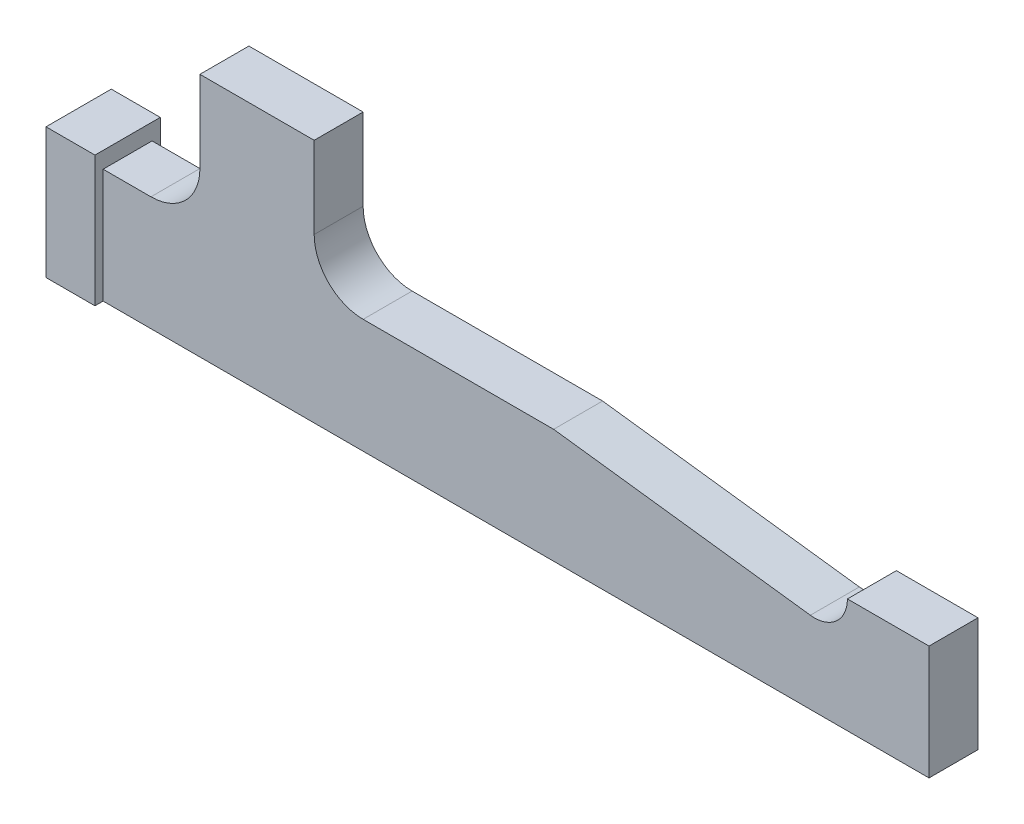
ISO-10303-21;
HEADER;
FILE_DESCRIPTION(('STEP AP214'),'2;1');
FILE_NAME('part.step','',(''),(''),'','','');
FILE_SCHEMA(('AUTOMOTIVE_DESIGN { 1 0 10303 214 1 1 1 1 }'));
ENDSEC;
DATA;
#1=APPLICATION_CONTEXT('core data for automotive mechanical design processes');
#2=APPLICATION_PROTOCOL_DEFINITION('international standard','automotive_design',2000,#1);
#3=PRODUCT_CONTEXT('',#1,'mechanical');
#4=PRODUCT('Part','Part','',(#3));
#5=PRODUCT_RELATED_PRODUCT_CATEGORY('part','',(#4));
#6=PRODUCT_DEFINITION_FORMATION('','',#4);
#7=PRODUCT_DEFINITION_CONTEXT('part definition',#1,'design');
#8=PRODUCT_DEFINITION('design','',#6,#7);
#9=PRODUCT_DEFINITION_SHAPE('','',#8);
#10=(LENGTH_UNIT() NAMED_UNIT(*) SI_UNIT(.MILLI.,.METRE.));
#11=(NAMED_UNIT(*) PLANE_ANGLE_UNIT() SI_UNIT($,.RADIAN.));
#12=(NAMED_UNIT(*) SI_UNIT($,.STERADIAN.) SOLID_ANGLE_UNIT());
#13=UNCERTAINTY_MEASURE_WITH_UNIT(LENGTH_MEASURE(1.E-05),#10,'distance_accuracy_value','');
#14=(GEOMETRIC_REPRESENTATION_CONTEXT(3) GLOBAL_UNCERTAINTY_ASSIGNED_CONTEXT((#13)) GLOBAL_UNIT_ASSIGNED_CONTEXT((#10,
#11,#12)) REPRESENTATION_CONTEXT('',''));
#15=CARTESIAN_POINT('',(0.,0.,0.));
#16=DIRECTION('',(0.,0.,1.));
#17=DIRECTION('',(1.,0.,0.));
#18=AXIS2_PLACEMENT_3D('',#15,#16,#17);
#19=CARTESIAN_POINT('',(0.,7.,1.5));
#20=DIRECTION('',(0.,-1.,0.));
#21=DIRECTION('',(1.,0.,0.));
#22=AXIS2_PLACEMENT_3D('',#19,#20,#21);
#23=PLANE('',#22);
#24=DIRECTION('',(-1.,0.,0.));
#25=VECTOR('',#24,1.);
#26=CARTESIAN_POINT('',(0.,7.,-1.5));
#27=LINE('',#26,#25);
#28=CARTESIAN_POINT('',(0.,7.,-1.5));
#29=VERTEX_POINT('',#28);
#30=CARTESIAN_POINT('',(-5.,7.,-1.5));
#31=VERTEX_POINT('',#30);
#32=EDGE_CURVE('E162',#29,#31,#27,.T.);
#33=ORIENTED_EDGE('',*,*,#32,.T.);
#34=DIRECTION('',(0.,0.,-1.));
#35=VECTOR('',#34,1.);
#36=CARTESIAN_POINT('',(-5.,7.,1.5));
#37=LINE('',#36,#35);
#38=CARTESIAN_POINT('',(-5.,7.,1.5));
#39=VERTEX_POINT('',#38);
#40=EDGE_CURVE('E11',#39,#31,#37,.T.);
#41=ORIENTED_EDGE('',*,*,#40,.F.);
#42=DIRECTION('',(-1.,0.,0.));
#43=VECTOR('',#42,1.);
#44=CARTESIAN_POINT('',(0.,7.,1.5));
#45=LINE('',#44,#43);
#46=CARTESIAN_POINT('',(0.,7.,1.5));
#47=VERTEX_POINT('',#46);
#48=EDGE_CURVE('E169',#47,#39,#45,.T.);
#49=ORIENTED_EDGE('',*,*,#48,.F.);
#50=DIRECTION('',(0.,0.,-1.));
#51=VECTOR('',#50,1.);
#52=CARTESIAN_POINT('',(0.,7.,1.5));
#53=LINE('',#52,#51);
#54=EDGE_CURVE('E194',#47,#29,#53,.T.);
#55=ORIENTED_EDGE('',*,*,#54,.T.);
#56=EDGE_LOOP('',(#33,#41,#49,#55));
#57=FACE_BOUND('',#56,.T.);
#58=ADVANCED_FACE('F35',(#57),#23,.F.);
#59=CARTESIAN_POINT('',(-7.01610200176435,7.,1.5));
#60=DIRECTION('',(0.,0.,-1.));
#61=DIRECTION('',(-1.,0.,0.));
#62=AXIS2_PLACEMENT_3D('',#59,#60,#61);
#63=CYLINDRICAL_SURFACE('',#62,2.01610200176435);
#64=CARTESIAN_POINT('',(-7.01610200176435,7.,-1.5));
#65=DIRECTION('',(0.,0.,1.));
#66=DIRECTION('',(1.,0.,0.));
#67=AXIS2_PLACEMENT_3D('',#64,#65,#66);
#68=CIRCLE('',#67,2.01610200176435);
#69=CARTESIAN_POINT('',(-7.27039962565853,5.,-1.5));
#70=VERTEX_POINT('',#69);
#71=EDGE_CURVE('E197',#31,#70,#68,.F.);
#72=ORIENTED_EDGE('',*,*,#71,.T.);
#73=DIRECTION('',(0.,0.,-1.));
#74=VECTOR('',#73,1.);
#75=CARTESIAN_POINT('',(-7.27039962565853,5.,1.5));
#76=LINE('',#75,#74);
#77=CARTESIAN_POINT('',(-7.27039962565853,5.,1.5));
#78=VERTEX_POINT('',#77);
#79=EDGE_CURVE('E43',#78,#70,#76,.T.);
#80=ORIENTED_EDGE('',*,*,#79,.F.);
#81=CARTESIAN_POINT('',(-7.01610200176435,7.,1.5));
#82=DIRECTION('',(0.,0.,1.));
#83=DIRECTION('',(1.,0.,0.));
#84=AXIS2_PLACEMENT_3D('',#81,#82,#83);
#85=CIRCLE('',#84,2.01610200176435);
#86=EDGE_CURVE('E103',#39,#78,#85,.F.);
#87=ORIENTED_EDGE('',*,*,#86,.F.);
#88=ORIENTED_EDGE('',*,*,#40,.T.);
#89=EDGE_LOOP('',(#72,#80,#87,#88));
#90=FACE_BOUND('',#89,.T.);
#91=ADVANCED_FACE('F251',(#90),#63,.F.);
#92=CARTESIAN_POINT('',(0.509960377082842,4.01073646913078,1.5));
#93=DIRECTION('',(0.126133312536585,0.992013300046198,0.));
#94=DIRECTION('',(-0.992013300046198,0.126133312536585,0.));
#95=AXIS2_PLACEMENT_3D('',#92,#93,#94);
#96=PLANE('',#95);
#97=DIRECTION('',(0.992013300046198,-0.126133312536585,0.));
#98=VECTOR('',#97,1.);
#99=CARTESIAN_POINT('',(0.509960377082842,4.01073646913078,-1.5));
#100=LINE('',#99,#98);
#101=CARTESIAN_POINT('',(-23.,7.,-1.5));
#102=VERTEX_POINT('',#101);
#103=EDGE_CURVE('E200',#102,#70,#100,.T.);
#104=ORIENTED_EDGE('',*,*,#103,.F.);
#105=DIRECTION('',(0.,0.,-1.));
#106=VECTOR('',#105,1.);
#107=CARTESIAN_POINT('',(-23.,7.,1.5));
#108=LINE('',#107,#106);
#109=CARTESIAN_POINT('',(-23.,7.,1.5));
#110=VERTEX_POINT('',#109);
#111=EDGE_CURVE('E246',#110,#102,#108,.T.);
#112=ORIENTED_EDGE('',*,*,#111,.F.);
#113=DIRECTION('',(0.992013300046198,-0.126133312536585,0.));
#114=VECTOR('',#113,1.);
#115=CARTESIAN_POINT('',(0.509960377082842,4.01073646913078,1.5));
#116=LINE('',#115,#114);
#117=EDGE_CURVE('E172',#110,#78,#116,.T.);
#118=ORIENTED_EDGE('',*,*,#117,.T.);
#119=ORIENTED_EDGE('',*,*,#79,.T.);
#120=EDGE_LOOP('',(#104,#112,#118,#119));
#121=FACE_BOUND('',#120,.T.);
#122=ADVANCED_FACE('F249',(#121),#96,.T.);
#123=CARTESIAN_POINT('',(0.,7.00000000000002,1.5));
#124=DIRECTION('',(0.,1.,0.));
#125=DIRECTION('',(-1.,0.,0.));
#126=AXIS2_PLACEMENT_3D('',#123,#124,#125);
#127=PLANE('',#126);
#128=DIRECTION('',(1.,0.,0.));
#129=VECTOR('',#128,1.);
#130=CARTESIAN_POINT('',(0.,7.00000000000002,-1.5));
#131=LINE('',#130,#129);
#132=CARTESIAN_POINT('',(-34.67,6.99999999999999,-1.5));
#133=VERTEX_POINT('',#132);
#134=EDGE_CURVE('E203',#133,#102,#131,.T.);
#135=ORIENTED_EDGE('',*,*,#134,.F.);
#136=DIRECTION('',(0.,0.,-1.));
#137=VECTOR('',#136,1.);
#138=CARTESIAN_POINT('',(-34.67,6.99999999999999,1.5));
#139=LINE('',#138,#137);
#140=CARTESIAN_POINT('',(-34.67,6.99999999999999,1.5));
#141=VERTEX_POINT('',#140);
#142=EDGE_CURVE('E244',#141,#133,#139,.T.);
#143=ORIENTED_EDGE('',*,*,#142,.F.);
#144=DIRECTION('',(1.,0.,0.));
#145=VECTOR('',#144,1.);
#146=CARTESIAN_POINT('',(0.,7.00000000000002,1.5));
#147=LINE('',#146,#145);
#148=EDGE_CURVE('E175',#141,#110,#147,.T.);
#149=ORIENTED_EDGE('',*,*,#148,.T.);
#150=ORIENTED_EDGE('',*,*,#111,.T.);
#151=EDGE_LOOP('',(#135,#143,#149,#150));
#152=FACE_BOUND('',#151,.T.);
#153=ADVANCED_FACE('F259',(#152),#127,.T.);
#154=CARTESIAN_POINT('',(-34.67,9.99999999999999,1.5));
#155=DIRECTION('',(0.,0.,-1.));
#156=DIRECTION('',(-1.,0.,0.));
#157=AXIS2_PLACEMENT_3D('',#154,#155,#156);
#158=CYLINDRICAL_SURFACE('',#157,3.);
#159=CARTESIAN_POINT('',(-34.67,9.99999999999999,-1.5));
#160=DIRECTION('',(0.,0.,1.));
#161=DIRECTION('',(1.,0.,0.));
#162=AXIS2_PLACEMENT_3D('',#159,#160,#161);
#163=CIRCLE('',#162,3.);
#164=CARTESIAN_POINT('',(-37.67,9.99999999999999,-1.5));
#165=VERTEX_POINT('',#164);
#166=EDGE_CURVE('E206',#165,#133,#163,.T.);
#167=ORIENTED_EDGE('',*,*,#166,.F.);
#168=DIRECTION('',(0.,0.,-1.));
#169=VECTOR('',#168,1.);
#170=CARTESIAN_POINT('',(-37.67,9.99999999999999,1.5));
#171=LINE('',#170,#169);
#172=CARTESIAN_POINT('',(-37.67,9.99999999999999,1.5));
#173=VERTEX_POINT('',#172);
#174=EDGE_CURVE('E242',#173,#165,#171,.T.);
#175=ORIENTED_EDGE('',*,*,#174,.F.);
#176=CARTESIAN_POINT('',(-34.67,9.99999999999999,1.5));
#177=DIRECTION('',(0.,0.,1.));
#178=DIRECTION('',(1.,0.,0.));
#179=AXIS2_PLACEMENT_3D('',#176,#177,#178);
#180=CIRCLE('',#179,3.);
#181=EDGE_CURVE('E178',#173,#141,#180,.T.);
#182=ORIENTED_EDGE('',*,*,#181,.T.);
#183=ORIENTED_EDGE('',*,*,#142,.T.);
#184=EDGE_LOOP('',(#167,#175,#182,#183));
#185=FACE_BOUND('',#184,.T.);
#186=ADVANCED_FACE('F320',(#185),#158,.F.);
#187=CARTESIAN_POINT('',(-37.67,0.,1.5));
#188=DIRECTION('',(1.,0.,0.));
#189=DIRECTION('',(0.,0.,-1.));
#190=AXIS2_PLACEMENT_3D('',#187,#188,#189);
#191=PLANE('',#190);
#192=DIRECTION('',(0.,-1.,0.));
#193=VECTOR('',#192,1.);
#194=CARTESIAN_POINT('',(-37.67,0.,-1.5));
#195=LINE('',#194,#193);
#196=CARTESIAN_POINT('',(-37.67,15.,-1.5));
#197=VERTEX_POINT('',#196);
#198=EDGE_CURVE('E209',#197,#165,#195,.T.);
#199=ORIENTED_EDGE('',*,*,#198,.F.);
#200=DIRECTION('',(0.,0.,-1.));
#201=VECTOR('',#200,1.);
#202=CARTESIAN_POINT('',(-37.67,15.,1.5));
#203=LINE('',#202,#201);
#204=CARTESIAN_POINT('',(-37.67,15.,1.5));
#205=VERTEX_POINT('',#204);
#206=EDGE_CURVE('E240',#205,#197,#203,.T.);
#207=ORIENTED_EDGE('',*,*,#206,.F.);
#208=DIRECTION('',(0.,-1.,0.));
#209=VECTOR('',#208,1.);
#210=CARTESIAN_POINT('',(-37.67,0.,1.5));
#211=LINE('',#210,#209);
#212=EDGE_CURVE('E181',#205,#173,#211,.T.);
#213=ORIENTED_EDGE('',*,*,#212,.T.);
#214=ORIENTED_EDGE('',*,*,#174,.T.);
#215=EDGE_LOOP('',(#199,#207,#213,#214));
#216=FACE_BOUND('',#215,.T.);
#217=ADVANCED_FACE('F317',(#216),#191,.T.);
#218=CARTESIAN_POINT('',(0.,15.,1.5));
#219=DIRECTION('',(0.,1.,0.));
#220=DIRECTION('',(-1.,0.,0.));
#221=AXIS2_PLACEMENT_3D('',#218,#219,#220);
#222=PLANE('',#221);
#223=DIRECTION('',(1.,0.,0.));
#224=VECTOR('',#223,1.);
#225=CARTESIAN_POINT('',(0.,15.,-1.5));
#226=LINE('',#225,#224);
#227=CARTESIAN_POINT('',(-44.67,15.,-1.5));
#228=VERTEX_POINT('',#227);
#229=EDGE_CURVE('E212',#228,#197,#226,.T.);
#230=ORIENTED_EDGE('',*,*,#229,.F.);
#231=DIRECTION('',(0.,0.,-1.));
#232=VECTOR('',#231,1.);
#233=CARTESIAN_POINT('',(-44.67,15.,1.5));
#234=LINE('',#233,#232);
#235=CARTESIAN_POINT('',(-44.67,15.,1.5));
#236=VERTEX_POINT('',#235);
#237=EDGE_CURVE('E238',#236,#228,#234,.T.);
#238=ORIENTED_EDGE('',*,*,#237,.F.);
#239=DIRECTION('',(1.,0.,0.));
#240=VECTOR('',#239,1.);
#241=CARTESIAN_POINT('',(0.,15.,1.5));
#242=LINE('',#241,#240);
#243=EDGE_CURVE('E184',#236,#205,#242,.T.);
#244=ORIENTED_EDGE('',*,*,#243,.T.);
#245=ORIENTED_EDGE('',*,*,#206,.T.);
#246=EDGE_LOOP('',(#230,#238,#244,#245));
#247=FACE_BOUND('',#246,.T.);
#248=ADVANCED_FACE('F314',(#247),#222,.T.);
#249=CARTESIAN_POINT('',(-44.67,0.,1.5));
#250=DIRECTION('',(-1.,0.,0.));
#251=DIRECTION('',(0.,-1.,0.));
#252=AXIS2_PLACEMENT_3D('',#249,#250,#251);
#253=PLANE('',#252);
#254=DIRECTION('',(0.,1.,0.));
#255=VECTOR('',#254,1.);
#256=CARTESIAN_POINT('',(-44.67,0.,-1.5));
#257=LINE('',#256,#255);
#258=CARTESIAN_POINT('',(-44.67,9.99999999999999,-1.5));
#259=VERTEX_POINT('',#258);
#260=EDGE_CURVE('E215',#259,#228,#257,.T.);
#261=ORIENTED_EDGE('',*,*,#260,.F.);
#262=DIRECTION('',(0.,0.,-1.));
#263=VECTOR('',#262,1.);
#264=CARTESIAN_POINT('',(-44.67,9.99999999999999,1.5));
#265=LINE('',#264,#263);
#266=CARTESIAN_POINT('',(-44.67,9.99999999999999,1.5));
#267=VERTEX_POINT('',#266);
#268=EDGE_CURVE('E236',#267,#259,#265,.T.);
#269=ORIENTED_EDGE('',*,*,#268,.F.);
#270=DIRECTION('',(0.,1.,0.));
#271=VECTOR('',#270,1.);
#272=CARTESIAN_POINT('',(-44.67,0.,1.5));
#273=LINE('',#272,#271);
#274=EDGE_CURVE('E187',#267,#236,#273,.T.);
#275=ORIENTED_EDGE('',*,*,#274,.T.);
#276=ORIENTED_EDGE('',*,*,#237,.T.);
#277=EDGE_LOOP('',(#261,#269,#275,#276));
#278=FACE_BOUND('',#277,.T.);
#279=ADVANCED_FACE('F308',(#278),#253,.T.);
#280=CARTESIAN_POINT('',(-47.67,9.99999999999999,1.5));
#281=DIRECTION('',(0.,0.,-1.));
#282=DIRECTION('',(-1.,0.,0.));
#283=AXIS2_PLACEMENT_3D('',#280,#281,#282);
#284=CYLINDRICAL_SURFACE('',#283,3.);
#285=CARTESIAN_POINT('',(-47.67,9.99999999999999,-1.5));
#286=DIRECTION('',(0.,0.,1.));
#287=DIRECTION('',(1.,0.,0.));
#288=AXIS2_PLACEMENT_3D('',#285,#286,#287);
#289=CIRCLE('',#288,3.);
#290=CARTESIAN_POINT('',(-47.67,6.99999999999999,-1.5));
#291=VERTEX_POINT('',#290);
#292=EDGE_CURVE('E218',#259,#291,#289,.F.);
#293=ORIENTED_EDGE('',*,*,#292,.T.);
#294=DIRECTION('',(0.,0.,-1.));
#295=VECTOR('',#294,1.);
#296=CARTESIAN_POINT('',(-47.67,6.99999999999999,1.5));
#297=LINE('',#296,#295);
#298=CARTESIAN_POINT('',(-47.67,6.99999999999999,1.5));
#299=VERTEX_POINT('',#298);
#300=EDGE_CURVE('E234',#299,#291,#297,.T.);
#301=ORIENTED_EDGE('',*,*,#300,.F.);
#302=CARTESIAN_POINT('',(-47.67,9.99999999999999,1.5));
#303=DIRECTION('',(0.,0.,1.));
#304=DIRECTION('',(1.,0.,0.));
#305=AXIS2_PLACEMENT_3D('',#302,#303,#304);
#306=CIRCLE('',#305,3.);
#307=EDGE_CURVE('E190',#267,#299,#306,.F.);
#308=ORIENTED_EDGE('',*,*,#307,.F.);
#309=ORIENTED_EDGE('',*,*,#268,.T.);
#310=EDGE_LOOP('',(#293,#301,#308,#309));
#311=FACE_BOUND('',#310,.T.);
#312=ADVANCED_FACE('F321',(#311),#284,.F.);
#313=CARTESIAN_POINT('',(0.,6.99999999999999,1.5));
#314=DIRECTION('',(0.,1.,0.));
#315=DIRECTION('',(0.,0.,1.));
#316=AXIS2_PLACEMENT_3D('',#313,#314,#315);
#317=PLANE('',#316);
#318=DIRECTION('',(1.,0.,0.));
#319=VECTOR('',#318,1.);
#320=CARTESIAN_POINT('',(0.,6.99999999999999,-1.5));
#321=LINE('',#320,#319);
#322=CARTESIAN_POINT('',(-50.6,6.99999999999999,-1.5));
#323=VERTEX_POINT('',#322);
#324=EDGE_CURVE('E221',#323,#291,#321,.T.);
#325=ORIENTED_EDGE('',*,*,#324,.F.);
#326=DIRECTION('',(0.,0.,-1.));
#327=VECTOR('',#326,1.);
#328=CARTESIAN_POINT('',(-50.6,6.99999999999999,1.5));
#329=LINE('',#328,#327);
#330=CARTESIAN_POINT('',(-50.6,6.99999999999999,1.5));
#331=VERTEX_POINT('',#330);
#332=EDGE_CURVE('E232',#331,#323,#329,.T.);
#333=ORIENTED_EDGE('',*,*,#332,.F.);
#334=DIRECTION('',(1.,0.,0.));
#335=VECTOR('',#334,1.);
#336=CARTESIAN_POINT('',(0.,6.99999999999999,1.5));
#337=LINE('',#336,#335);
#338=EDGE_CURVE('E139',#331,#299,#337,.T.);
#339=ORIENTED_EDGE('',*,*,#338,.T.);
#340=ORIENTED_EDGE('',*,*,#300,.T.);
#341=EDGE_LOOP('',(#325,#333,#339,#340));
#342=FACE_BOUND('',#341,.T.);
#343=ADVANCED_FACE('F302',(#342),#317,.T.);
#344=CARTESIAN_POINT('',(0.,0.,1.5));
#345=DIRECTION('',(0.,-1.,0.));
#346=DIRECTION('',(1.,0.,0.));
#347=AXIS2_PLACEMENT_3D('',#344,#345,#346);
#348=PLANE('',#347);
#349=DIRECTION('',(-1.,0.,0.));
#350=VECTOR('',#349,1.);
#351=CARTESIAN_POINT('',(0.,0.,-1.5));
#352=LINE('',#351,#350);
#353=CARTESIAN_POINT('',(0.,0.,-1.5));
#354=VERTEX_POINT('',#353);
#355=CARTESIAN_POINT('',(-50.6,0.,-1.5));
#356=VERTEX_POINT('',#355);
#357=EDGE_CURVE('E227',#354,#356,#352,.T.);
#358=ORIENTED_EDGE('',*,*,#357,.F.);
#359=DIRECTION('',(0.,0.,-1.));
#360=VECTOR('',#359,1.);
#361=CARTESIAN_POINT('',(0.,0.,1.5));
#362=LINE('',#361,#360);
#363=CARTESIAN_POINT('',(0.,0.,1.5));
#364=VERTEX_POINT('',#363);
#365=EDGE_CURVE('E92',#364,#354,#362,.T.);
#366=ORIENTED_EDGE('',*,*,#365,.F.);
#367=DIRECTION('',(-1.,0.,0.));
#368=VECTOR('',#367,1.);
#369=CARTESIAN_POINT('',(0.,0.,1.5));
#370=LINE('',#369,#368);
#371=CARTESIAN_POINT('',(-50.6,0.,1.5));
#372=VERTEX_POINT('',#371);
#373=EDGE_CURVE('E137',#364,#372,#370,.T.);
#374=ORIENTED_EDGE('',*,*,#373,.T.);
#375=DIRECTION('',(0.,0.,-1.));
#376=VECTOR('',#375,1.);
#377=CARTESIAN_POINT('',(-50.6,0.,2.));
#378=LINE('',#377,#376);
#379=CARTESIAN_POINT('',(-50.6,0.,2.));
#380=VERTEX_POINT('',#379);
#381=EDGE_CURVE('E150',#380,#372,#378,.T.);
#382=ORIENTED_EDGE('',*,*,#381,.F.);
#383=DIRECTION('',(-1.,0.,0.));
#384=VECTOR('',#383,1.);
#385=CARTESIAN_POINT('',(0.,0.,2.));
#386=LINE('',#385,#384);
#387=CARTESIAN_POINT('',(-53.6,0.,2.));
#388=VERTEX_POINT('',#387);
#389=EDGE_CURVE('E462',#380,#388,#386,.T.);
#390=ORIENTED_EDGE('',*,*,#389,.T.);
#391=DIRECTION('',(0.,0.,-1.));
#392=VECTOR('',#391,1.);
#393=CARTESIAN_POINT('',(-53.6,0.,2.));
#394=LINE('',#393,#392);
#395=CARTESIAN_POINT('',(-53.6,0.,-2.));
#396=VERTEX_POINT('',#395);
#397=EDGE_CURVE('E158',#388,#396,#394,.T.);
#398=ORIENTED_EDGE('',*,*,#397,.T.);
#399=DIRECTION('',(-1.,0.,0.));
#400=VECTOR('',#399,1.);
#401=CARTESIAN_POINT('',(0.,0.,-2.));
#402=LINE('',#401,#400);
#403=CARTESIAN_POINT('',(-50.6,0.,-2.));
#404=VERTEX_POINT('',#403);
#405=EDGE_CURVE('E269',#404,#396,#402,.T.);
#406=ORIENTED_EDGE('',*,*,#405,.F.);
#407=EDGE_CURVE('E159',#356,#404,#378,.T.);
#408=ORIENTED_EDGE('',*,*,#407,.F.);
#409=EDGE_LOOP('',(#358,#366,#374,#382,#390,#398,#406,#408));
#410=FACE_BOUND('',#409,.T.);
#411=ADVANCED_FACE('F147',(#410),#348,.T.);
#412=CARTESIAN_POINT('',(0.,0.,1.5));
#413=DIRECTION('',(-1.,0.,0.));
#414=DIRECTION('',(0.,0.,1.));
#415=AXIS2_PLACEMENT_3D('',#412,#413,#414);
#416=PLANE('',#415);
#417=DIRECTION('',(0.,1.,0.));
#418=VECTOR('',#417,1.);
#419=CARTESIAN_POINT('',(0.,0.,-1.5));
#420=LINE('',#419,#418);
#421=EDGE_CURVE('E95',#354,#29,#420,.T.);
#422=ORIENTED_EDGE('',*,*,#421,.T.);
#423=ORIENTED_EDGE('',*,*,#54,.F.);
#424=DIRECTION('',(0.,1.,0.));
#425=VECTOR('',#424,1.);
#426=CARTESIAN_POINT('',(0.,0.,1.5));
#427=LINE('',#426,#425);
#428=EDGE_CURVE('E51',#364,#47,#427,.T.);
#429=ORIENTED_EDGE('',*,*,#428,.F.);
#430=ORIENTED_EDGE('',*,*,#365,.T.);
#431=EDGE_LOOP('',(#422,#423,#429,#430));
#432=FACE_BOUND('',#431,.T.);
#433=ADVANCED_FACE('F364',(#432),#416,.F.);
#434=CARTESIAN_POINT('',(0.,0.,1.5));
#435=DIRECTION('',(0.,0.,1.));
#436=DIRECTION('',(1.,0.,0.));
#437=AXIS2_PLACEMENT_3D('',#434,#435,#436);
#438=PLANE('',#437);
#439=ORIENTED_EDGE('',*,*,#48,.T.);
#440=ORIENTED_EDGE('',*,*,#86,.T.);
#441=ORIENTED_EDGE('',*,*,#117,.F.);
#442=ORIENTED_EDGE('',*,*,#148,.F.);
#443=ORIENTED_EDGE('',*,*,#181,.F.);
#444=ORIENTED_EDGE('',*,*,#212,.F.);
#445=ORIENTED_EDGE('',*,*,#243,.F.);
#446=ORIENTED_EDGE('',*,*,#274,.F.);
#447=ORIENTED_EDGE('',*,*,#307,.T.);
#448=ORIENTED_EDGE('',*,*,#338,.F.);
#449=DIRECTION('',(0.,-1.,0.));
#450=VECTOR('',#449,1.);
#451=CARTESIAN_POINT('',(-50.6,0.,1.5));
#452=LINE('',#451,#450);
#453=EDGE_CURVE('E134',#331,#372,#452,.T.);
#454=ORIENTED_EDGE('',*,*,#453,.T.);
#455=ORIENTED_EDGE('',*,*,#373,.F.);
#456=ORIENTED_EDGE('',*,*,#428,.T.);
#457=EDGE_LOOP('',(#439,#440,#441,#442,#443,#444,#445,#446,#447,#448,#454,#455,#456));
#458=FACE_BOUND('',#457,.T.);
#459=ADVANCED_FACE('F136',(#458),#438,.T.);
#460=CARTESIAN_POINT('',(0.,0.,-1.5));
#461=DIRECTION('',(0.,0.,1.));
#462=DIRECTION('',(1.,0.,0.));
#463=AXIS2_PLACEMENT_3D('',#460,#461,#462);
#464=PLANE('',#463);
#465=ORIENTED_EDGE('',*,*,#32,.F.);
#466=ORIENTED_EDGE('',*,*,#421,.F.);
#467=ORIENTED_EDGE('',*,*,#357,.T.);
#468=DIRECTION('',(0.,-1.,0.));
#469=VECTOR('',#468,1.);
#470=CARTESIAN_POINT('',(-50.6,0.,-1.5));
#471=LINE('',#470,#469);
#472=EDGE_CURVE('E224',#323,#356,#471,.T.);
#473=ORIENTED_EDGE('',*,*,#472,.F.);
#474=ORIENTED_EDGE('',*,*,#324,.T.);
#475=ORIENTED_EDGE('',*,*,#292,.F.);
#476=ORIENTED_EDGE('',*,*,#260,.T.);
#477=ORIENTED_EDGE('',*,*,#229,.T.);
#478=ORIENTED_EDGE('',*,*,#198,.T.);
#479=ORIENTED_EDGE('',*,*,#166,.T.);
#480=ORIENTED_EDGE('',*,*,#134,.T.);
#481=ORIENTED_EDGE('',*,*,#103,.T.);
#482=ORIENTED_EDGE('',*,*,#71,.F.);
#483=EDGE_LOOP('',(#465,#466,#467,#473,#474,#475,#476,#477,#478,#479,#480,#481,#482));
#484=FACE_BOUND('',#483,.T.);
#485=ADVANCED_FACE('F255',(#484),#464,.F.);
#486=CARTESIAN_POINT('',(-53.6,0.,2.));
#487=DIRECTION('',(-1.,0.,0.));
#488=DIRECTION('',(0.,0.,1.));
#489=AXIS2_PLACEMENT_3D('',#486,#487,#488);
#490=PLANE('',#489);
#491=DIRECTION('',(0.,1.,0.));
#492=VECTOR('',#491,1.);
#493=CARTESIAN_POINT('',(-53.6,0.,-2.));
#494=LINE('',#493,#492);
#495=CARTESIAN_POINT('',(-53.6,7.99999999999999,-2.));
#496=VERTEX_POINT('',#495);
#497=EDGE_CURVE('E453',#396,#496,#494,.T.);
#498=ORIENTED_EDGE('',*,*,#497,.F.);
#499=ORIENTED_EDGE('',*,*,#397,.F.);
#500=DIRECTION('',(0.,1.,0.));
#501=VECTOR('',#500,1.);
#502=CARTESIAN_POINT('',(-53.6,0.,2.));
#503=LINE('',#502,#501);
#504=CARTESIAN_POINT('',(-53.6,7.99999999999999,2.));
#505=VERTEX_POINT('',#504);
#506=EDGE_CURVE('E461',#388,#505,#503,.T.);
#507=ORIENTED_EDGE('',*,*,#506,.T.);
#508=DIRECTION('',(0.,0.,-1.));
#509=VECTOR('',#508,1.);
#510=CARTESIAN_POINT('',(-53.6,7.99999999999999,2.));
#511=LINE('',#510,#509);
#512=EDGE_CURVE('E287',#505,#496,#511,.T.);
#513=ORIENTED_EDGE('',*,*,#512,.T.);
#514=EDGE_LOOP('',(#498,#499,#507,#513));
#515=FACE_BOUND('',#514,.T.);
#516=ADVANCED_FACE('F401',(#515),#490,.T.);
#517=CARTESIAN_POINT('',(-50.6,0.,2.));
#518=DIRECTION('',(1.,0.,0.));
#519=DIRECTION('',(0.,0.,-1.));
#520=AXIS2_PLACEMENT_3D('',#517,#518,#519);
#521=PLANE('',#520);
#522=ORIENTED_EDGE('',*,*,#332,.T.);
#523=ORIENTED_EDGE('',*,*,#472,.T.);
#524=ORIENTED_EDGE('',*,*,#407,.T.);
#525=DIRECTION('',(0.,-1.,0.));
#526=VECTOR('',#525,1.);
#527=CARTESIAN_POINT('',(-50.6,0.,-2.));
#528=LINE('',#527,#526);
#529=CARTESIAN_POINT('',(-50.6,7.99999999999999,-2.));
#530=VERTEX_POINT('',#529);
#531=EDGE_CURVE('E273',#530,#404,#528,.T.);
#532=ORIENTED_EDGE('',*,*,#531,.F.);
#533=DIRECTION('',(0.,0.,-1.));
#534=VECTOR('',#533,1.);
#535=CARTESIAN_POINT('',(-50.6,7.99999999999999,2.));
#536=LINE('',#535,#534);
#537=CARTESIAN_POINT('',(-50.6,7.99999999999999,2.));
#538=VERTEX_POINT('',#537);
#539=EDGE_CURVE('E165',#538,#530,#536,.T.);
#540=ORIENTED_EDGE('',*,*,#539,.F.);
#541=DIRECTION('',(0.,-1.,0.));
#542=VECTOR('',#541,1.);
#543=CARTESIAN_POINT('',(-50.6,0.,2.));
#544=LINE('',#543,#542);
#545=EDGE_CURVE('E157',#538,#380,#544,.T.);
#546=ORIENTED_EDGE('',*,*,#545,.T.);
#547=ORIENTED_EDGE('',*,*,#381,.T.);
#548=ORIENTED_EDGE('',*,*,#453,.F.);
#549=EDGE_LOOP('',(#522,#523,#524,#532,#540,#546,#547,#548));
#550=FACE_BOUND('',#549,.T.);
#551=ADVANCED_FACE('F154',(#550),#521,.T.);
#552=CARTESIAN_POINT('',(0.,8.00000000000002,2.));
#553=DIRECTION('',(0.,-1.,0.));
#554=DIRECTION('',(1.,0.,0.));
#555=AXIS2_PLACEMENT_3D('',#552,#553,#554);
#556=PLANE('',#555);
#557=DIRECTION('',(-1.,0.,0.));
#558=VECTOR('',#557,1.);
#559=CARTESIAN_POINT('',(0.,8.00000000000002,-2.));
#560=LINE('',#559,#558);
#561=EDGE_CURVE('E454',#530,#496,#560,.T.);
#562=ORIENTED_EDGE('',*,*,#561,.T.);
#563=ORIENTED_EDGE('',*,*,#512,.F.);
#564=DIRECTION('',(-1.,0.,0.));
#565=VECTOR('',#564,1.);
#566=CARTESIAN_POINT('',(0.,8.00000000000002,2.));
#567=LINE('',#566,#565);
#568=EDGE_CURVE('E299',#538,#505,#567,.T.);
#569=ORIENTED_EDGE('',*,*,#568,.F.);
#570=ORIENTED_EDGE('',*,*,#539,.T.);
#571=EDGE_LOOP('',(#562,#563,#569,#570));
#572=FACE_BOUND('',#571,.T.);
#573=ADVANCED_FACE('F418',(#572),#556,.F.);
#574=CARTESIAN_POINT('',(0.,0.,2.));
#575=DIRECTION('',(0.,0.,1.));
#576=DIRECTION('',(1.,0.,0.));
#577=AXIS2_PLACEMENT_3D('',#574,#575,#576);
#578=PLANE('',#577);
#579=ORIENTED_EDGE('',*,*,#506,.F.);
#580=ORIENTED_EDGE('',*,*,#389,.F.);
#581=ORIENTED_EDGE('',*,*,#545,.F.);
#582=ORIENTED_EDGE('',*,*,#568,.T.);
#583=EDGE_LOOP('',(#579,#580,#581,#582));
#584=FACE_BOUND('',#583,.T.);
#585=ADVANCED_FACE('F428',(#584),#578,.T.);
#586=CARTESIAN_POINT('',(0.,0.,-2.));
#587=DIRECTION('',(0.,0.,1.));
#588=DIRECTION('',(1.,0.,0.));
#589=AXIS2_PLACEMENT_3D('',#586,#587,#588);
#590=PLANE('',#589);
#591=ORIENTED_EDGE('',*,*,#497,.T.);
#592=ORIENTED_EDGE('',*,*,#561,.F.);
#593=ORIENTED_EDGE('',*,*,#531,.T.);
#594=ORIENTED_EDGE('',*,*,#405,.T.);
#595=EDGE_LOOP('',(#591,#592,#593,#594));
#596=FACE_BOUND('',#595,.T.);
#597=ADVANCED_FACE('F438',(#596),#590,.F.);
#598=CLOSED_SHELL('',(#58,#91,#122,#153,#186,#217,#248,#279,#312,#343,#411,#433,#459,#485,#516,
#551,#573,#585,#597));
#599=MANIFOLD_SOLID_BREP('B2',#598);
#600=ADVANCED_BREP_SHAPE_REPRESENTATION('',(#18,#599),#14);
#601=SHAPE_DEFINITION_REPRESENTATION(#9,#600);
ENDSEC;
END-ISO-10303-21;
